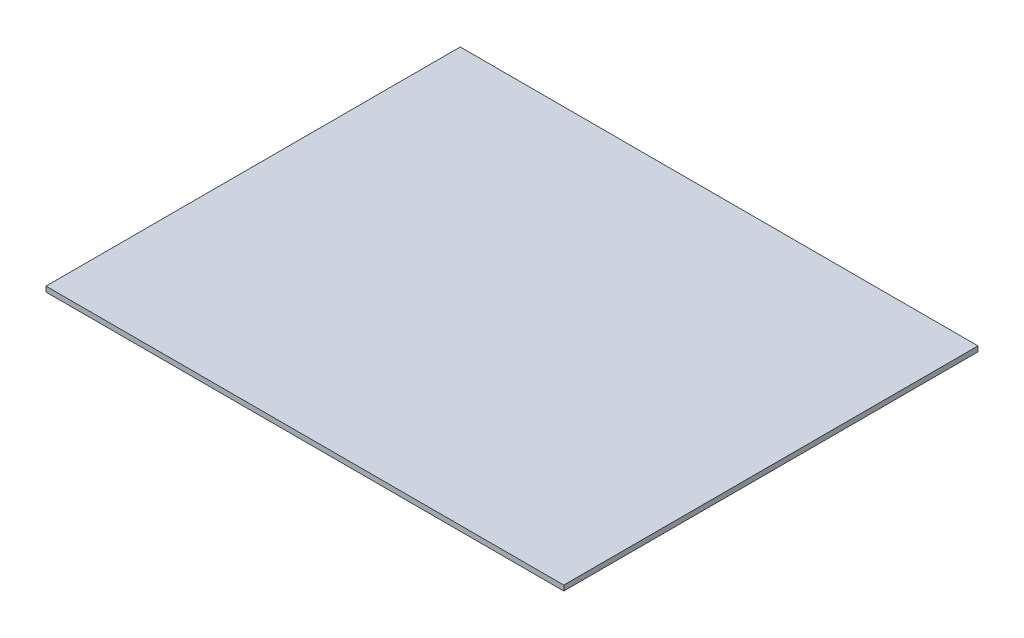
ISO-10303-21;
HEADER;
FILE_DESCRIPTION(('STEP AP214'),'2;1');
FILE_NAME('part.step','',(''),(''),'','','');
FILE_SCHEMA(('AUTOMOTIVE_DESIGN { 1 0 10303 214 1 1 1 1 }'));
ENDSEC;
DATA;
#1=APPLICATION_CONTEXT('core data for automotive mechanical design processes');
#2=APPLICATION_PROTOCOL_DEFINITION('international standard','automotive_design',2000,#1);
#3=PRODUCT_CONTEXT('',#1,'mechanical');
#4=PRODUCT('Part','Part','',(#3));
#5=PRODUCT_RELATED_PRODUCT_CATEGORY('part','',(#4));
#6=PRODUCT_DEFINITION_FORMATION('','',#4);
#7=PRODUCT_DEFINITION_CONTEXT('part definition',#1,'design');
#8=PRODUCT_DEFINITION('design','',#6,#7);
#9=PRODUCT_DEFINITION_SHAPE('','',#8);
#10=(LENGTH_UNIT() NAMED_UNIT(*) SI_UNIT(.MILLI.,.METRE.));
#11=(NAMED_UNIT(*) PLANE_ANGLE_UNIT() SI_UNIT($,.RADIAN.));
#12=(NAMED_UNIT(*) SI_UNIT($,.STERADIAN.) SOLID_ANGLE_UNIT());
#13=UNCERTAINTY_MEASURE_WITH_UNIT(LENGTH_MEASURE(1.E-05),#10,'distance_accuracy_value','');
#14=(GEOMETRIC_REPRESENTATION_CONTEXT(3) GLOBAL_UNCERTAINTY_ASSIGNED_CONTEXT((#13)) GLOBAL_UNIT_ASSIGNED_CONTEXT((#10,
#11,#12)) REPRESENTATION_CONTEXT('',''));
#15=CARTESIAN_POINT('',(0.,0.,0.));
#16=DIRECTION('',(0.,0.,1.));
#17=DIRECTION('',(1.,0.,0.));
#18=AXIS2_PLACEMENT_3D('',#15,#16,#17);
#19=CARTESIAN_POINT('',(-250.,5.,-200.));
#20=DIRECTION('',(1.,0.,0.));
#21=DIRECTION('',(0.,0.,-1.));
#22=AXIS2_PLACEMENT_3D('',#19,#20,#21);
#23=PLANE('',#22);
#24=DIRECTION('',(0.,0.,1.));
#25=VECTOR('',#24,1.);
#26=CARTESIAN_POINT('',(-250.,0.,-200.));
#27=LINE('',#26,#25);
#28=CARTESIAN_POINT('',(-250.,0.,-200.));
#29=VERTEX_POINT('',#28);
#30=CARTESIAN_POINT('',(-250.,0.,200.));
#31=VERTEX_POINT('',#30);
#32=EDGE_CURVE('E95',#29,#31,#27,.T.);
#33=ORIENTED_EDGE('',*,*,#32,.T.);
#34=DIRECTION('',(0.,-1.,0.));
#35=VECTOR('',#34,1.);
#36=CARTESIAN_POINT('',(-250.,5.,200.));
#37=LINE('',#36,#35);
#38=CARTESIAN_POINT('',(-250.,5.,200.));
#39=VERTEX_POINT('',#38);
#40=EDGE_CURVE('E11',#39,#31,#37,.T.);
#41=ORIENTED_EDGE('',*,*,#40,.F.);
#42=DIRECTION('',(0.,0.,1.));
#43=VECTOR('',#42,1.);
#44=CARTESIAN_POINT('',(-250.,5.,-200.));
#45=LINE('',#44,#43);
#46=CARTESIAN_POINT('',(-250.,5.,-200.));
#47=VERTEX_POINT('',#46);
#48=EDGE_CURVE('E83',#47,#39,#45,.T.);
#49=ORIENTED_EDGE('',*,*,#48,.F.);
#50=DIRECTION('',(0.,-1.,0.));
#51=VECTOR('',#50,1.);
#52=CARTESIAN_POINT('',(-250.,5.,-200.));
#53=LINE('',#52,#51);
#54=EDGE_CURVE('E91',#47,#29,#53,.T.);
#55=ORIENTED_EDGE('',*,*,#54,.T.);
#56=EDGE_LOOP('',(#33,#41,#49,#55));
#57=FACE_BOUND('',#56,.T.);
#58=ADVANCED_FACE('F32',(#57),#23,.F.);
#59=CARTESIAN_POINT('',(-250.,5.,200.));
#60=DIRECTION('',(0.,0.,-1.));
#61=DIRECTION('',(-1.,0.,0.));
#62=AXIS2_PLACEMENT_3D('',#59,#60,#61);
#63=PLANE('',#62);
#64=DIRECTION('',(1.,0.,0.));
#65=VECTOR('',#64,1.);
#66=CARTESIAN_POINT('',(-250.,0.,200.));
#67=LINE('',#66,#65);
#68=CARTESIAN_POINT('',(250.,0.,200.));
#69=VERTEX_POINT('',#68);
#70=EDGE_CURVE('E87',#31,#69,#67,.T.);
#71=ORIENTED_EDGE('',*,*,#70,.T.);
#72=DIRECTION('',(0.,-1.,0.));
#73=VECTOR('',#72,1.);
#74=CARTESIAN_POINT('',(250.,5.,200.));
#75=LINE('',#74,#73);
#76=CARTESIAN_POINT('',(250.,5.,200.));
#77=VERTEX_POINT('',#76);
#78=EDGE_CURVE('E40',#77,#69,#75,.T.);
#79=ORIENTED_EDGE('',*,*,#78,.F.);
#80=DIRECTION('',(1.,0.,0.));
#81=VECTOR('',#80,1.);
#82=CARTESIAN_POINT('',(-250.,5.,200.));
#83=LINE('',#82,#81);
#84=EDGE_CURVE('E78',#39,#77,#83,.T.);
#85=ORIENTED_EDGE('',*,*,#84,.F.);
#86=ORIENTED_EDGE('',*,*,#40,.T.);
#87=EDGE_LOOP('',(#71,#79,#85,#86));
#88=FACE_BOUND('',#87,.T.);
#89=ADVANCED_FACE('F86',(#88),#63,.F.);
#90=CARTESIAN_POINT('',(250.,5.,-200.));
#91=DIRECTION('',(-1.,0.,0.));
#92=DIRECTION('',(0.,0.,1.));
#93=AXIS2_PLACEMENT_3D('',#90,#91,#92);
#94=PLANE('',#93);
#95=DIRECTION('',(0.,0.,-1.));
#96=VECTOR('',#95,1.);
#97=CARTESIAN_POINT('',(250.,0.,-200.));
#98=LINE('',#97,#96);
#99=CARTESIAN_POINT('',(250.,0.,-200.));
#100=VERTEX_POINT('',#99);
#101=EDGE_CURVE('E65',#69,#100,#98,.T.);
#102=ORIENTED_EDGE('',*,*,#101,.T.);
#103=DIRECTION('',(0.,-1.,0.));
#104=VECTOR('',#103,1.);
#105=CARTESIAN_POINT('',(250.,5.,-200.));
#106=LINE('',#105,#104);
#107=CARTESIAN_POINT('',(250.,5.,-200.));
#108=VERTEX_POINT('',#107);
#109=EDGE_CURVE('E88',#108,#100,#106,.T.);
#110=ORIENTED_EDGE('',*,*,#109,.F.);
#111=DIRECTION('',(0.,0.,-1.));
#112=VECTOR('',#111,1.);
#113=CARTESIAN_POINT('',(250.,5.,-200.));
#114=LINE('',#113,#112);
#115=EDGE_CURVE('E81',#77,#108,#114,.T.);
#116=ORIENTED_EDGE('',*,*,#115,.F.);
#117=ORIENTED_EDGE('',*,*,#78,.T.);
#118=EDGE_LOOP('',(#102,#110,#116,#117));
#119=FACE_BOUND('',#118,.T.);
#120=ADVANCED_FACE('F89',(#119),#94,.F.);
#121=CARTESIAN_POINT('',(-250.,5.,-200.));
#122=DIRECTION('',(0.,0.,1.));
#123=DIRECTION('',(1.,0.,0.));
#124=AXIS2_PLACEMENT_3D('',#121,#122,#123);
#125=PLANE('',#124);
#126=DIRECTION('',(-1.,0.,0.));
#127=VECTOR('',#126,1.);
#128=CARTESIAN_POINT('',(-250.,0.,-200.));
#129=LINE('',#128,#127);
#130=EDGE_CURVE('E71',#100,#29,#129,.T.);
#131=ORIENTED_EDGE('',*,*,#130,.T.);
#132=ORIENTED_EDGE('',*,*,#54,.F.);
#133=DIRECTION('',(-1.,0.,0.));
#134=VECTOR('',#133,1.);
#135=CARTESIAN_POINT('',(-250.,5.,-200.));
#136=LINE('',#135,#134);
#137=EDGE_CURVE('E48',#108,#47,#136,.T.);
#138=ORIENTED_EDGE('',*,*,#137,.F.);
#139=ORIENTED_EDGE('',*,*,#109,.T.);
#140=EDGE_LOOP('',(#131,#132,#138,#139));
#141=FACE_BOUND('',#140,.T.);
#142=ADVANCED_FACE('F102',(#141),#125,.F.);
#143=CARTESIAN_POINT('',(0.,5.,0.));
#144=DIRECTION('',(0.,1.,0.));
#145=DIRECTION('',(0.,0.,1.));
#146=AXIS2_PLACEMENT_3D('',#143,#144,#145);
#147=PLANE('',#146);
#148=ORIENTED_EDGE('',*,*,#48,.T.);
#149=ORIENTED_EDGE('',*,*,#84,.T.);
#150=ORIENTED_EDGE('',*,*,#115,.T.);
#151=ORIENTED_EDGE('',*,*,#137,.T.);
#152=EDGE_LOOP('',(#148,#149,#150,#151));
#153=FACE_BOUND('',#152,.T.);
#154=ADVANCED_FACE('F79',(#153),#147,.T.);
#155=CARTESIAN_POINT('',(0.,0.,0.));
#156=DIRECTION('',(0.,1.,0.));
#157=DIRECTION('',(0.,0.,1.));
#158=AXIS2_PLACEMENT_3D('',#155,#156,#157);
#159=PLANE('',#158);
#160=ORIENTED_EDGE('',*,*,#32,.F.);
#161=ORIENTED_EDGE('',*,*,#130,.F.);
#162=ORIENTED_EDGE('',*,*,#101,.F.);
#163=ORIENTED_EDGE('',*,*,#70,.F.);
#164=EDGE_LOOP('',(#160,#161,#162,#163));
#165=FACE_BOUND('',#164,.T.);
#166=ADVANCED_FACE('F105',(#165),#159,.F.);
#167=CLOSED_SHELL('',(#58,#89,#120,#142,#154,#166));
#168=MANIFOLD_SOLID_BREP('B2',#167);
#169=ADVANCED_BREP_SHAPE_REPRESENTATION('',(#18,#168),#14);
#170=SHAPE_DEFINITION_REPRESENTATION(#9,#169);
ENDSEC;
END-ISO-10303-21;
